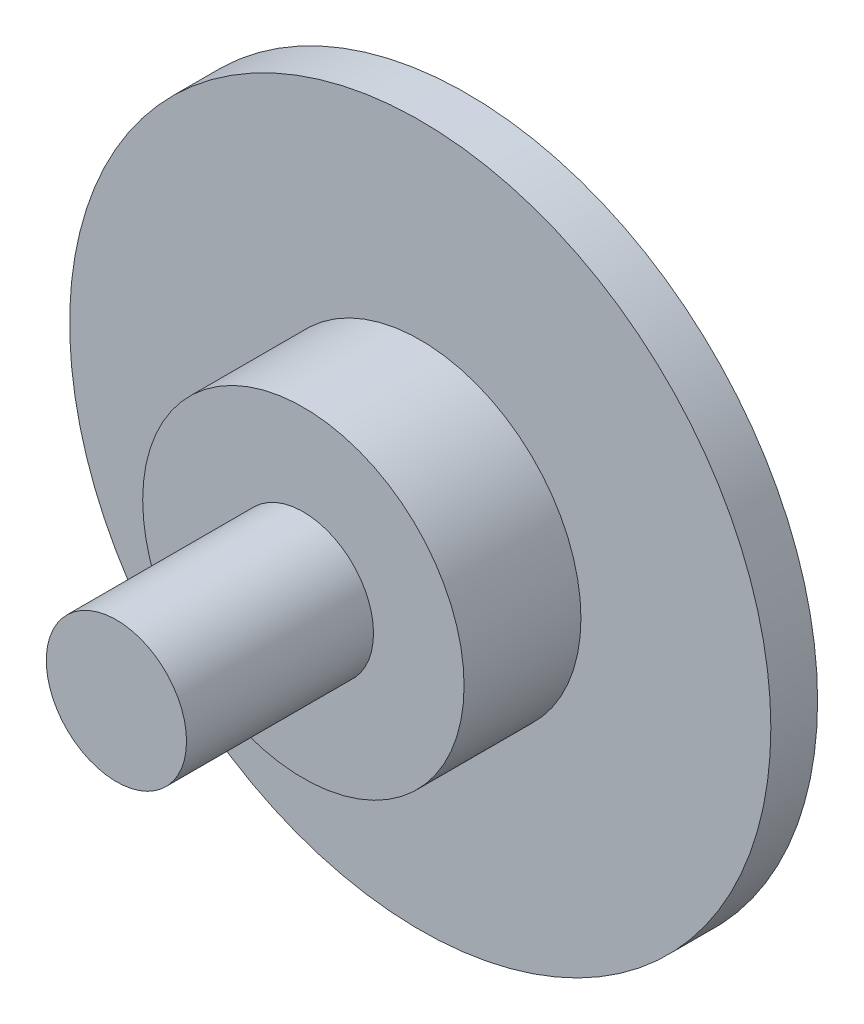
ISO-10303-21;
HEADER;
FILE_DESCRIPTION(('STEP AP214'),'2;1');
FILE_NAME('part.step','',(''),(''),'','','');
FILE_SCHEMA(('AUTOMOTIVE_DESIGN { 1 0 10303 214 1 1 1 1 }'));
ENDSEC;
DATA;
#1=APPLICATION_CONTEXT('core data for automotive mechanical design processes');
#2=APPLICATION_PROTOCOL_DEFINITION('international standard','automotive_design',2000,#1);
#3=PRODUCT_CONTEXT('',#1,'mechanical');
#4=PRODUCT('Part','Part','',(#3));
#5=PRODUCT_RELATED_PRODUCT_CATEGORY('part','',(#4));
#6=PRODUCT_DEFINITION_FORMATION('','',#4);
#7=PRODUCT_DEFINITION_CONTEXT('part definition',#1,'design');
#8=PRODUCT_DEFINITION('design','',#6,#7);
#9=PRODUCT_DEFINITION_SHAPE('','',#8);
#10=(LENGTH_UNIT() NAMED_UNIT(*) SI_UNIT(.MILLI.,.METRE.));
#11=(NAMED_UNIT(*) PLANE_ANGLE_UNIT() SI_UNIT($,.RADIAN.));
#12=(NAMED_UNIT(*) SI_UNIT($,.STERADIAN.) SOLID_ANGLE_UNIT());
#13=UNCERTAINTY_MEASURE_WITH_UNIT(LENGTH_MEASURE(1.E-05),#10,'distance_accuracy_value','');
#14=(GEOMETRIC_REPRESENTATION_CONTEXT(3) GLOBAL_UNCERTAINTY_ASSIGNED_CONTEXT((#13)) GLOBAL_UNIT_ASSIGNED_CONTEXT((#10,
#11,#12)) REPRESENTATION_CONTEXT('',''));
#15=CARTESIAN_POINT('',(0.,0.,0.));
#16=DIRECTION('',(0.,0.,1.));
#17=DIRECTION('',(1.,0.,0.));
#18=AXIS2_PLACEMENT_3D('',#15,#16,#17);
#19=CARTESIAN_POINT('',(0.,0.,2.));
#20=DIRECTION('',(0.,0.,-1.));
#21=DIRECTION('',(-1.,0.,0.));
#22=AXIS2_PLACEMENT_3D('',#19,#20,#21);
#23=CYLINDRICAL_SURFACE('',#22,15.);
#24=CARTESIAN_POINT('',(0.,0.,2.));
#25=DIRECTION('',(0.,0.,1.));
#26=DIRECTION('',(1.,0.,0.));
#27=AXIS2_PLACEMENT_3D('',#24,#25,#26);
#28=CIRCLE('',#27,15.);
#29=CARTESIAN_POINT('',(15.,0.,2.));
#30=VERTEX_POINT('',#29);
#31=EDGE_CURVE('E51',#30,#30,#28,.T.);
#32=ORIENTED_EDGE('',*,*,#31,.F.);
#33=EDGE_LOOP('',(#32));
#34=FACE_BOUND('',#33,.T.);
#35=CARTESIAN_POINT('',(0.,0.,0.));
#36=DIRECTION('',(0.,0.,1.));
#37=DIRECTION('',(1.,0.,0.));
#38=AXIS2_PLACEMENT_3D('',#35,#36,#37);
#39=CIRCLE('',#38,15.);
#40=CARTESIAN_POINT('',(15.,0.,0.));
#41=VERTEX_POINT('',#40);
#42=EDGE_CURVE('E40',#41,#41,#39,.T.);
#43=ORIENTED_EDGE('',*,*,#42,.T.);
#44=EDGE_LOOP('',(#43));
#45=FACE_BOUND('',#44,.T.);
#46=ADVANCED_FACE('F37',(#34,#45),#23,.T.);
#47=CARTESIAN_POINT('',(0.,0.,2.));
#48=DIRECTION('',(0.,0.,1.));
#49=DIRECTION('',(1.,0.,0.));
#50=AXIS2_PLACEMENT_3D('',#47,#48,#49);
#51=PLANE('',#50);
#52=CARTESIAN_POINT('',(0.,0.,2.));
#53=DIRECTION('',(0.,0.,1.));
#54=DIRECTION('',(1.,0.,0.));
#55=AXIS2_PLACEMENT_3D('',#52,#53,#54);
#56=CIRCLE('',#55,6.875);
#57=CARTESIAN_POINT('',(6.875,0.,2.));
#58=VERTEX_POINT('',#57);
#59=EDGE_CURVE('E45',#58,#58,#56,.T.);
#60=ORIENTED_EDGE('',*,*,#59,.F.);
#61=EDGE_LOOP('',(#60));
#62=FACE_BOUND('',#61,.T.);
#63=ORIENTED_EDGE('',*,*,#31,.T.);
#64=EDGE_LOOP('',(#63));
#65=FACE_BOUND('',#64,.T.);
#66=ADVANCED_FACE('F71',(#62,#65),#51,.T.);
#67=CARTESIAN_POINT('',(0.,0.,0.));
#68=DIRECTION('',(0.,0.,1.));
#69=DIRECTION('',(1.,0.,0.));
#70=AXIS2_PLACEMENT_3D('',#67,#68,#69);
#71=PLANE('',#70);
#72=ORIENTED_EDGE('',*,*,#42,.F.);
#73=EDGE_LOOP('',(#72));
#74=FACE_BOUND('',#73,.T.);
#75=ADVANCED_FACE('F68',(#74),#71,.F.);
#76=CARTESIAN_POINT('',(0.,0.,7.));
#77=DIRECTION('',(0.,0.,-1.));
#78=DIRECTION('',(-1.,0.,0.));
#79=AXIS2_PLACEMENT_3D('',#76,#77,#78);
#80=CYLINDRICAL_SURFACE('',#79,6.875);
#81=CARTESIAN_POINT('',(0.,0.,7.));
#82=DIRECTION('',(0.,0.,1.));
#83=DIRECTION('',(1.,0.,0.));
#84=AXIS2_PLACEMENT_3D('',#81,#82,#83);
#85=CIRCLE('',#84,6.875);
#86=CARTESIAN_POINT('',(6.875,0.,7.));
#87=VERTEX_POINT('',#86);
#88=EDGE_CURVE('E56',#87,#87,#85,.T.);
#89=ORIENTED_EDGE('',*,*,#88,.F.);
#90=EDGE_LOOP('',(#89));
#91=FACE_BOUND('',#90,.T.);
#92=ORIENTED_EDGE('',*,*,#59,.T.);
#93=EDGE_LOOP('',(#92));
#94=FACE_BOUND('',#93,.T.);
#95=ADVANCED_FACE('F70',(#91,#94),#80,.T.);
#96=CARTESIAN_POINT('',(0.,0.,7.));
#97=DIRECTION('',(0.,0.,1.));
#98=DIRECTION('',(1.,0.,0.));
#99=AXIS2_PLACEMENT_3D('',#96,#97,#98);
#100=PLANE('',#99);
#101=CARTESIAN_POINT('',(0.,0.,7.));
#102=DIRECTION('',(0.,0.,1.));
#103=DIRECTION('',(1.,0.,0.));
#104=AXIS2_PLACEMENT_3D('',#101,#102,#103);
#105=CIRCLE('',#104,3.);
#106=CARTESIAN_POINT('',(3.,0.,7.));
#107=VERTEX_POINT('',#106);
#108=EDGE_CURVE('E10',#107,#107,#105,.T.);
#109=ORIENTED_EDGE('',*,*,#108,.F.);
#110=EDGE_LOOP('',(#109));
#111=FACE_BOUND('',#110,.T.);
#112=ORIENTED_EDGE('',*,*,#88,.T.);
#113=EDGE_LOOP('',(#112));
#114=FACE_BOUND('',#113,.T.);
#115=ADVANCED_FACE('F76',(#111,#114),#100,.T.);
#116=CARTESIAN_POINT('',(0.,0.,15.));
#117=DIRECTION('',(0.,0.,-1.));
#118=DIRECTION('',(-1.,0.,0.));
#119=AXIS2_PLACEMENT_3D('',#116,#117,#118);
#120=CYLINDRICAL_SURFACE('',#119,3.);
#121=CARTESIAN_POINT('',(0.,0.,15.));
#122=DIRECTION('',(0.,0.,1.));
#123=DIRECTION('',(1.,0.,0.));
#124=AXIS2_PLACEMENT_3D('',#121,#122,#123);
#125=CIRCLE('',#124,3.);
#126=CARTESIAN_POINT('',(3.,0.,15.));
#127=VERTEX_POINT('',#126);
#128=EDGE_CURVE('E55',#127,#127,#125,.T.);
#129=ORIENTED_EDGE('',*,*,#128,.F.);
#130=EDGE_LOOP('',(#129));
#131=FACE_BOUND('',#130,.T.);
#132=ORIENTED_EDGE('',*,*,#108,.T.);
#133=EDGE_LOOP('',(#132));
#134=FACE_BOUND('',#133,.T.);
#135=ADVANCED_FACE('F106',(#131,#134),#120,.T.);
#136=CARTESIAN_POINT('',(0.,0.,15.));
#137=DIRECTION('',(0.,0.,1.));
#138=DIRECTION('',(1.,0.,0.));
#139=AXIS2_PLACEMENT_3D('',#136,#137,#138);
#140=PLANE('',#139);
#141=ORIENTED_EDGE('',*,*,#128,.T.);
#142=EDGE_LOOP('',(#141));
#143=FACE_BOUND('',#142,.T.);
#144=ADVANCED_FACE('F116',(#143),#140,.T.);
#145=CLOSED_SHELL('',(#46,#66,#75,#95,#115,#135,#144));
#146=MANIFOLD_SOLID_BREP('B2',#145);
#147=ADVANCED_BREP_SHAPE_REPRESENTATION('',(#18,#146),#14);
#148=SHAPE_DEFINITION_REPRESENTATION(#9,#147);
ENDSEC;
END-ISO-10303-21;
